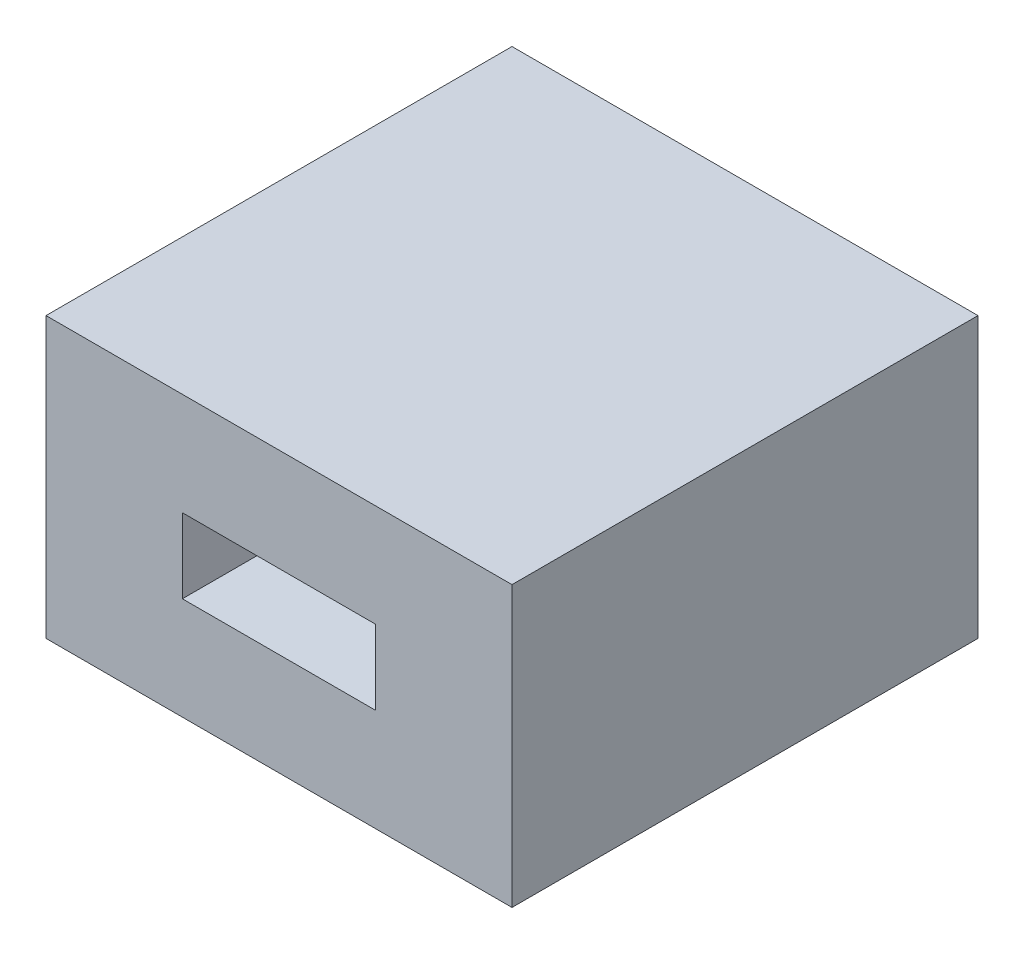
ISO-10303-21;
HEADER;
FILE_DESCRIPTION(('STEP AP214'),'2;1');
FILE_NAME('part.step','',(''),(''),'','','');
FILE_SCHEMA(('AUTOMOTIVE_DESIGN { 1 0 10303 214 1 1 1 1 }'));
ENDSEC;
DATA;
#1=APPLICATION_CONTEXT('core data for automotive mechanical design processes');
#2=APPLICATION_PROTOCOL_DEFINITION('international standard','automotive_design',2000,#1);
#3=PRODUCT_CONTEXT('',#1,'mechanical');
#4=PRODUCT('Part','Part','',(#3));
#5=PRODUCT_RELATED_PRODUCT_CATEGORY('part','',(#4));
#6=PRODUCT_DEFINITION_FORMATION('','',#4);
#7=PRODUCT_DEFINITION_CONTEXT('part definition',#1,'design');
#8=PRODUCT_DEFINITION('design','',#6,#7);
#9=PRODUCT_DEFINITION_SHAPE('','',#8);
#10=(LENGTH_UNIT() NAMED_UNIT(*) SI_UNIT(.MILLI.,.METRE.));
#11=(NAMED_UNIT(*) PLANE_ANGLE_UNIT() SI_UNIT($,.RADIAN.));
#12=(NAMED_UNIT(*) SI_UNIT($,.STERADIAN.) SOLID_ANGLE_UNIT());
#13=UNCERTAINTY_MEASURE_WITH_UNIT(LENGTH_MEASURE(1.E-05),#10,'distance_accuracy_value','');
#14=(GEOMETRIC_REPRESENTATION_CONTEXT(3) GLOBAL_UNCERTAINTY_ASSIGNED_CONTEXT((#13)) GLOBAL_UNIT_ASSIGNED_CONTEXT((#10,
#11,#12)) REPRESENTATION_CONTEXT('',''));
#15=CARTESIAN_POINT('',(0.,0.,0.));
#16=DIRECTION('',(0.,0.,1.));
#17=DIRECTION('',(1.,0.,0.));
#18=AXIS2_PLACEMENT_3D('',#15,#16,#17);
#19=CARTESIAN_POINT('',(12.5,15.,-12.5));
#20=DIRECTION('',(-1.,0.,0.));
#21=DIRECTION('',(0.,0.,1.));
#22=AXIS2_PLACEMENT_3D('',#19,#20,#21);
#23=PLANE('',#22);
#24=DIRECTION('',(0.,0.,-1.));
#25=VECTOR('',#24,1.);
#26=CARTESIAN_POINT('',(12.5,0.,-12.5));
#27=LINE('',#26,#25);
#28=CARTESIAN_POINT('',(12.5,0.,12.5));
#29=VERTEX_POINT('',#28);
#30=CARTESIAN_POINT('',(12.5,0.,-12.5));
#31=VERTEX_POINT('',#30);
#32=EDGE_CURVE('E149',#29,#31,#27,.T.);
#33=ORIENTED_EDGE('',*,*,#32,.T.);
#34=DIRECTION('',(0.,-1.,0.));
#35=VECTOR('',#34,1.);
#36=CARTESIAN_POINT('',(12.5,15.,-12.5));
#37=LINE('',#36,#35);
#38=CARTESIAN_POINT('',(12.5,15.,-12.5));
#39=VERTEX_POINT('',#38);
#40=EDGE_CURVE('E11',#39,#31,#37,.T.);
#41=ORIENTED_EDGE('',*,*,#40,.F.);
#42=DIRECTION('',(0.,0.,-1.));
#43=VECTOR('',#42,1.);
#44=CARTESIAN_POINT('',(12.5,15.,-12.5));
#45=LINE('',#44,#43);
#46=CARTESIAN_POINT('',(12.5,15.,12.5));
#47=VERTEX_POINT('',#46);
#48=EDGE_CURVE('E166',#47,#39,#45,.T.);
#49=ORIENTED_EDGE('',*,*,#48,.F.);
#50=DIRECTION('',(0.,-1.,0.));
#51=VECTOR('',#50,1.);
#52=CARTESIAN_POINT('',(12.5,15.,12.5));
#53=LINE('',#52,#51);
#54=EDGE_CURVE('E176',#47,#29,#53,.T.);
#55=ORIENTED_EDGE('',*,*,#54,.T.);
#56=EDGE_LOOP('',(#33,#41,#49,#55));
#57=FACE_BOUND('',#56,.T.);
#58=ADVANCED_FACE('F41',(#57),#23,.F.);
#59=CARTESIAN_POINT('',(-12.5,15.,-12.5));
#60=DIRECTION('',(0.,0.,1.));
#61=DIRECTION('',(1.,0.,0.));
#62=AXIS2_PLACEMENT_3D('',#59,#60,#61);
#63=PLANE('',#62);
#64=DIRECTION('',(-1.,0.,0.));
#65=VECTOR('',#64,1.);
#66=CARTESIAN_POINT('',(-12.5,0.,-12.5));
#67=LINE('',#66,#65);
#68=CARTESIAN_POINT('',(-12.5,0.,-12.5));
#69=VERTEX_POINT('',#68);
#70=EDGE_CURVE('E180',#31,#69,#67,.T.);
#71=ORIENTED_EDGE('',*,*,#70,.T.);
#72=DIRECTION('',(0.,-1.,0.));
#73=VECTOR('',#72,1.);
#74=CARTESIAN_POINT('',(-12.5,15.,-12.5));
#75=LINE('',#74,#73);
#76=CARTESIAN_POINT('',(-12.5,15.,-12.5));
#77=VERTEX_POINT('',#76);
#78=EDGE_CURVE('E49',#77,#69,#75,.T.);
#79=ORIENTED_EDGE('',*,*,#78,.F.);
#80=DIRECTION('',(-1.,0.,0.));
#81=VECTOR('',#80,1.);
#82=CARTESIAN_POINT('',(-12.5,15.,-12.5));
#83=LINE('',#82,#81);
#84=EDGE_CURVE('E93',#39,#77,#83,.T.);
#85=ORIENTED_EDGE('',*,*,#84,.F.);
#86=ORIENTED_EDGE('',*,*,#40,.T.);
#87=EDGE_LOOP('',(#71,#79,#85,#86));
#88=FACE_BOUND('',#87,.T.);
#89=ADVANCED_FACE('F213',(#88),#63,.F.);
#90=CARTESIAN_POINT('',(-12.5,15.,-12.5));
#91=DIRECTION('',(1.,0.,0.));
#92=DIRECTION('',(0.,0.,-1.));
#93=AXIS2_PLACEMENT_3D('',#90,#91,#92);
#94=PLANE('',#93);
#95=DIRECTION('',(0.,0.,1.));
#96=VECTOR('',#95,1.);
#97=CARTESIAN_POINT('',(-12.5,0.,-12.5));
#98=LINE('',#97,#96);
#99=CARTESIAN_POINT('',(-12.5,0.,12.5));
#100=VERTEX_POINT('',#99);
#101=EDGE_CURVE('E183',#69,#100,#98,.T.);
#102=ORIENTED_EDGE('',*,*,#101,.T.);
#103=DIRECTION('',(0.,-1.,0.));
#104=VECTOR('',#103,1.);
#105=CARTESIAN_POINT('',(-12.5,15.,12.5));
#106=LINE('',#105,#104);
#107=CARTESIAN_POINT('',(-12.5,15.,12.5));
#108=VERTEX_POINT('',#107);
#109=EDGE_CURVE('E190',#108,#100,#106,.T.);
#110=ORIENTED_EDGE('',*,*,#109,.F.);
#111=DIRECTION('',(0.,0.,1.));
#112=VECTOR('',#111,1.);
#113=CARTESIAN_POINT('',(-12.5,15.,-12.5));
#114=LINE('',#113,#112);
#115=EDGE_CURVE('E171',#77,#108,#114,.T.);
#116=ORIENTED_EDGE('',*,*,#115,.F.);
#117=ORIENTED_EDGE('',*,*,#78,.T.);
#118=EDGE_LOOP('',(#102,#110,#116,#117));
#119=FACE_BOUND('',#118,.T.);
#120=ADVANCED_FACE('F197',(#119),#94,.F.);
#121=CARTESIAN_POINT('',(-12.5,15.,12.5));
#122=DIRECTION('',(0.,0.,-1.));
#123=DIRECTION('',(-1.,0.,0.));
#124=AXIS2_PLACEMENT_3D('',#121,#122,#123);
#125=PLANE('',#124);
#126=DIRECTION('',(-1.,0.,0.));
#127=VECTOR('',#126,1.);
#128=CARTESIAN_POINT('',(-5.18317722073373,9.5,12.5));
#129=LINE('',#128,#127);
#130=CARTESIAN_POINT('',(5.18317722073375,9.5,12.5));
#131=VERTEX_POINT('',#130);
#132=CARTESIAN_POINT('',(-5.18317722073373,9.5,12.5));
#133=VERTEX_POINT('',#132);
#134=EDGE_CURVE('E131',#131,#133,#129,.T.);
#135=ORIENTED_EDGE('',*,*,#134,.F.);
#136=DIRECTION('',(0.,1.,0.));
#137=VECTOR('',#136,1.);
#138=CARTESIAN_POINT('',(5.18317722073375,9.5,12.5));
#139=LINE('',#138,#137);
#140=CARTESIAN_POINT('',(5.18317722073375,5.5,12.5));
#141=VERTEX_POINT('',#140);
#142=EDGE_CURVE('E56',#141,#131,#139,.T.);
#143=ORIENTED_EDGE('',*,*,#142,.F.);
#144=DIRECTION('',(1.,0.,0.));
#145=VECTOR('',#144,1.);
#146=CARTESIAN_POINT('',(-5.18317722073373,5.5,12.5));
#147=LINE('',#146,#145);
#148=CARTESIAN_POINT('',(-5.18317722073373,5.5,12.5));
#149=VERTEX_POINT('',#148);
#150=EDGE_CURVE('E138',#149,#141,#147,.T.);
#151=ORIENTED_EDGE('',*,*,#150,.F.);
#152=DIRECTION('',(0.,-1.,0.));
#153=VECTOR('',#152,1.);
#154=CARTESIAN_POINT('',(-5.18317722073373,9.5,12.5));
#155=LINE('',#154,#153);
#156=EDGE_CURVE('E119',#133,#149,#155,.T.);
#157=ORIENTED_EDGE('',*,*,#156,.F.);
#158=EDGE_LOOP('',(#135,#143,#151,#157));
#159=FACE_BOUND('',#158,.T.);
#160=DIRECTION('',(1.,0.,0.));
#161=VECTOR('',#160,1.);
#162=CARTESIAN_POINT('',(-12.5,0.,12.5));
#163=LINE('',#162,#161);
#164=EDGE_CURVE('E86',#100,#29,#163,.T.);
#165=ORIENTED_EDGE('',*,*,#164,.T.);
#166=ORIENTED_EDGE('',*,*,#54,.F.);
#167=DIRECTION('',(1.,0.,0.));
#168=VECTOR('',#167,1.);
#169=CARTESIAN_POINT('',(-12.5,15.,12.5));
#170=LINE('',#169,#168);
#171=EDGE_CURVE('E65',#108,#47,#170,.T.);
#172=ORIENTED_EDGE('',*,*,#171,.F.);
#173=ORIENTED_EDGE('',*,*,#109,.T.);
#174=EDGE_LOOP('',(#165,#166,#172,#173));
#175=FACE_BOUND('',#174,.T.);
#176=ADVANCED_FACE('F136',(#159,#175),#125,.F.);
#177=CARTESIAN_POINT('',(0.,15.,0.));
#178=DIRECTION('',(0.,1.,0.));
#179=DIRECTION('',(0.,0.,1.));
#180=AXIS2_PLACEMENT_3D('',#177,#178,#179);
#181=PLANE('',#180);
#182=ORIENTED_EDGE('',*,*,#48,.T.);
#183=ORIENTED_EDGE('',*,*,#84,.T.);
#184=ORIENTED_EDGE('',*,*,#115,.T.);
#185=ORIENTED_EDGE('',*,*,#171,.T.);
#186=EDGE_LOOP('',(#182,#183,#184,#185));
#187=FACE_BOUND('',#186,.T.);
#188=ADVANCED_FACE('F206',(#187),#181,.T.);
#189=CARTESIAN_POINT('',(0.,0.,0.));
#190=DIRECTION('',(0.,1.,0.));
#191=DIRECTION('',(0.,0.,1.));
#192=AXIS2_PLACEMENT_3D('',#189,#190,#191);
#193=PLANE('',#192);
#194=ORIENTED_EDGE('',*,*,#32,.F.);
#195=ORIENTED_EDGE('',*,*,#164,.F.);
#196=ORIENTED_EDGE('',*,*,#101,.F.);
#197=ORIENTED_EDGE('',*,*,#70,.F.);
#198=EDGE_LOOP('',(#194,#195,#196,#197));
#199=FACE_BOUND('',#198,.T.);
#200=ADVANCED_FACE('F201',(#199),#193,.F.);
#201=CARTESIAN_POINT('',(5.18317722073375,9.5,12.5));
#202=DIRECTION('',(0.998134798421867,0.,-0.061048539534857));
#203=DIRECTION('',(-0.061048539534857,0.,-0.998134798421867));
#204=AXIS2_PLACEMENT_3D('',#201,#202,#203);
#205=PLANE('',#204);
#206=ORIENTED_EDGE('',*,*,#142,.T.);
#207=DIRECTION('',(0.0609350948971757,0.0609350948971757,0.99627999499124));
#208=VECTOR('',#207,1.);
#209=CARTESIAN_POINT('',(5.18317722073375,9.5,12.5));
#210=LINE('',#209,#208);
#211=CARTESIAN_POINT('',(3.71527433712212,8.03209711638837,-11.5));
#212=VERTEX_POINT('',#211);
#213=EDGE_CURVE('E128',#212,#131,#210,.T.);
#214=ORIENTED_EDGE('',*,*,#213,.F.);
#215=DIRECTION('',(0.,1.,0.));
#216=VECTOR('',#215,1.);
#217=CARTESIAN_POINT('',(3.71527433712212,0.,-11.5));
#218=LINE('',#217,#216);
#219=CARTESIAN_POINT('',(3.71527433712212,6.96790288361163,-11.5));
#220=VERTEX_POINT('',#219);
#221=EDGE_CURVE('E142',#220,#212,#218,.T.);
#222=ORIENTED_EDGE('',*,*,#221,.F.);
#223=DIRECTION('',(0.0609350948971757,-0.0609350948971757,0.99627999499124));
#224=VECTOR('',#223,1.);
#225=CARTESIAN_POINT('',(5.14468605736171,5.53849116337204,11.8706750417602));
#226=LINE('',#225,#224);
#227=EDGE_CURVE('E146',#220,#141,#226,.T.);
#228=ORIENTED_EDGE('',*,*,#227,.T.);
#229=EDGE_LOOP('',(#206,#214,#222,#228));
#230=FACE_BOUND('',#229,.T.);
#231=ADVANCED_FACE('F241',(#230),#205,.F.);
#232=CARTESIAN_POINT('',(-5.18317722073373,5.5,12.5));
#233=DIRECTION('',(0.,-0.998134798421867,-0.061048539534857));
#234=DIRECTION('',(0.,0.061048539534857,-0.998134798421867));
#235=AXIS2_PLACEMENT_3D('',#232,#233,#234);
#236=PLANE('',#235);
#237=ORIENTED_EDGE('',*,*,#150,.T.);
#238=ORIENTED_EDGE('',*,*,#227,.F.);
#239=DIRECTION('',(1.,0.,0.));
#240=VECTOR('',#239,1.);
#241=CARTESIAN_POINT('',(0.,6.96790288361163,-11.5));
#242=LINE('',#241,#240);
#243=CARTESIAN_POINT('',(-3.7152743371221,6.96790288361163,-11.5));
#244=VERTEX_POINT('',#243);
#245=EDGE_CURVE('E151',#244,#220,#242,.T.);
#246=ORIENTED_EDGE('',*,*,#245,.F.);
#247=DIRECTION('',(-0.0609350948971757,-0.0609350948971757,0.99627999499124));
#248=VECTOR('',#247,1.);
#249=CARTESIAN_POINT('',(-5.16832487757322,5.51485234316051,12.2571663358442));
#250=LINE('',#249,#248);
#251=EDGE_CURVE('E127',#244,#149,#250,.T.);
#252=ORIENTED_EDGE('',*,*,#251,.T.);
#253=EDGE_LOOP('',(#237,#238,#246,#252));
#254=FACE_BOUND('',#253,.T.);
#255=ADVANCED_FACE('F253',(#254),#236,.F.);
#256=CARTESIAN_POINT('',(-5.18317722073373,9.5,12.5));
#257=DIRECTION('',(-0.998134798421867,0.,-0.061048539534857));
#258=DIRECTION('',(-0.061048539534857,0.,0.998134798421867));
#259=AXIS2_PLACEMENT_3D('',#256,#257,#258);
#260=PLANE('',#259);
#261=ORIENTED_EDGE('',*,*,#156,.T.);
#262=ORIENTED_EDGE('',*,*,#251,.F.);
#263=DIRECTION('',(0.,-1.,0.));
#264=VECTOR('',#263,1.);
#265=CARTESIAN_POINT('',(-3.7152743371221,0.,-11.5));
#266=LINE('',#265,#264);
#267=CARTESIAN_POINT('',(-3.7152743371221,8.03209711638837,-11.5));
#268=VERTEX_POINT('',#267);
#269=EDGE_CURVE('E122',#268,#244,#266,.T.);
#270=ORIENTED_EDGE('',*,*,#269,.F.);
#271=DIRECTION('',(-0.0609350948971757,0.0609350948971757,0.99627999499124));
#272=VECTOR('',#271,1.);
#273=CARTESIAN_POINT('',(-5.18317722073373,9.5,12.5));
#274=LINE('',#273,#272);
#275=EDGE_CURVE('E115',#268,#133,#274,.T.);
#276=ORIENTED_EDGE('',*,*,#275,.T.);
#277=EDGE_LOOP('',(#261,#262,#270,#276));
#278=FACE_BOUND('',#277,.T.);
#279=ADVANCED_FACE('F117',(#278),#260,.F.);
#280=CARTESIAN_POINT('',(-5.18317722073373,9.5,12.5));
#281=DIRECTION('',(0.,0.998134798421867,-0.061048539534857));
#282=DIRECTION('',(0.,0.061048539534857,0.998134798421867));
#283=AXIS2_PLACEMENT_3D('',#280,#281,#282);
#284=PLANE('',#283);
#285=ORIENTED_EDGE('',*,*,#134,.T.);
#286=ORIENTED_EDGE('',*,*,#275,.F.);
#287=DIRECTION('',(-1.,0.,0.));
#288=VECTOR('',#287,1.);
#289=CARTESIAN_POINT('',(0.,8.03209711638837,-11.5));
#290=LINE('',#289,#288);
#291=EDGE_CURVE('E158',#212,#268,#290,.T.);
#292=ORIENTED_EDGE('',*,*,#291,.F.);
#293=ORIENTED_EDGE('',*,*,#213,.T.);
#294=EDGE_LOOP('',(#285,#286,#292,#293));
#295=FACE_BOUND('',#294,.T.);
#296=ADVANCED_FACE('F132',(#295),#284,.F.);
#297=CARTESIAN_POINT('',(0.,0.,-11.5));
#298=DIRECTION('',(0.,0.,1.));
#299=DIRECTION('',(1.,0.,0.));
#300=AXIS2_PLACEMENT_3D('',#297,#298,#299);
#301=PLANE('',#300);
#302=ORIENTED_EDGE('',*,*,#221,.T.);
#303=ORIENTED_EDGE('',*,*,#291,.T.);
#304=ORIENTED_EDGE('',*,*,#269,.T.);
#305=ORIENTED_EDGE('',*,*,#245,.T.);
#306=EDGE_LOOP('',(#302,#303,#304,#305));
#307=FACE_BOUND('',#306,.T.);
#308=ADVANCED_FACE('F279',(#307),#301,.T.);
#309=CLOSED_SHELL('',(#58,#89,#120,#176,#188,#200,#231,#255,#279,#296,#308));
#310=MANIFOLD_SOLID_BREP('B2',#309);
#311=ADVANCED_BREP_SHAPE_REPRESENTATION('',(#18,#310),#14);
#312=SHAPE_DEFINITION_REPRESENTATION(#9,#311);
ENDSEC;
END-ISO-10303-21;
